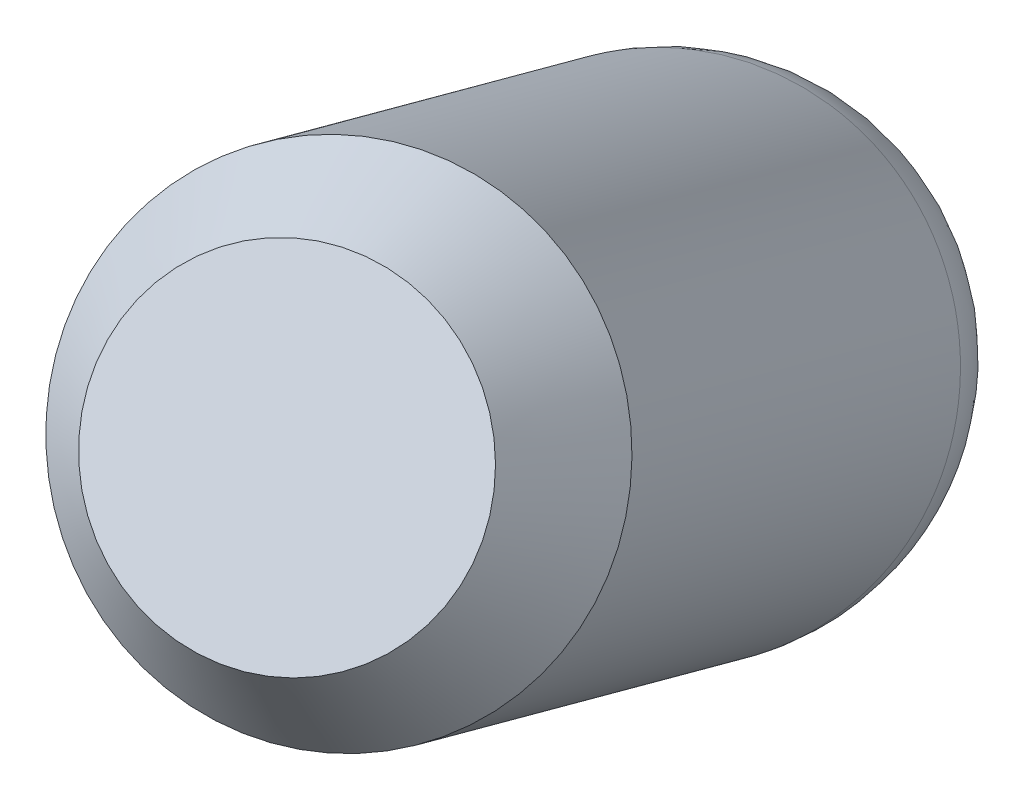
ISO-10303-21;
HEADER;
FILE_DESCRIPTION(('STEP AP214'),'2;1');
FILE_NAME('part.step','',(''),(''),'','','');
FILE_SCHEMA(('AUTOMOTIVE_DESIGN { 1 0 10303 214 1 1 1 1 }'));
ENDSEC;
DATA;
#1=APPLICATION_CONTEXT('core data for automotive mechanical design processes');
#2=APPLICATION_PROTOCOL_DEFINITION('international standard','automotive_design',2000,#1);
#3=PRODUCT_CONTEXT('',#1,'mechanical');
#4=PRODUCT('Part','Part','',(#3));
#5=PRODUCT_RELATED_PRODUCT_CATEGORY('part','',(#4));
#6=PRODUCT_DEFINITION_FORMATION('','',#4);
#7=PRODUCT_DEFINITION_CONTEXT('part definition',#1,'design');
#8=PRODUCT_DEFINITION('design','',#6,#7);
#9=PRODUCT_DEFINITION_SHAPE('','',#8);
#10=(LENGTH_UNIT() NAMED_UNIT(*) SI_UNIT(.MILLI.,.METRE.));
#11=(NAMED_UNIT(*) PLANE_ANGLE_UNIT() SI_UNIT($,.RADIAN.));
#12=(NAMED_UNIT(*) SI_UNIT($,.STERADIAN.) SOLID_ANGLE_UNIT());
#13=UNCERTAINTY_MEASURE_WITH_UNIT(LENGTH_MEASURE(1.E-05),#10,'distance_accuracy_value','');
#14=(GEOMETRIC_REPRESENTATION_CONTEXT(3) GLOBAL_UNCERTAINTY_ASSIGNED_CONTEXT((#13)) GLOBAL_UNIT_ASSIGNED_CONTEXT((#10,
#11,#12)) REPRESENTATION_CONTEXT('',''));
#15=CARTESIAN_POINT('',(0.,0.,0.));
#16=DIRECTION('',(0.,0.,1.));
#17=DIRECTION('',(1.,0.,0.));
#18=AXIS2_PLACEMENT_3D('',#15,#16,#17);
#19=CARTESIAN_POINT('',(-143.954565351431,536.193582255767,-563.997558569731));
#20=DIRECTION('',(0.342020143325556,0.469846310392971,0.813797681349412));
#21=DIRECTION('',(0.,-0.866025403784441,0.499999999999996));
#22=AXIS2_PLACEMENT_3D('',#19,#20,#21);
#23=PLANE('',#22);
#24=CARTESIAN_POINT('',(-139.117363935001,531.413633802481,-563.270816730183));
#25=DIRECTION('',(-0.342020143325572,-0.469846310392955,-0.813797681349414));
#26=DIRECTION('',(0.,0.866025403784449,-0.499999999999982));
#27=AXIS2_PLACEMENT_3D('',#24,#25,#26);
#28=CIRCLE('',#27,4.26794919425475);
#29=CARTESIAN_POINT('',(-139.117363935001,535.109786226767,-565.40479132731));
#30=VERTEX_POINT('',#29);
#31=EDGE_CURVE('E20',#30,#30,#28,.T.);
#32=ORIENTED_EDGE('',*,*,#31,.F.);
#33=EDGE_LOOP('',(#32));
#34=FACE_BOUND('',#33,.T.);
#35=ADVANCED_FACE('F17',(#34),#23,.T.);
#36=CARTESIAN_POINT('',(-140.143424365264,530.004094870909,-565.712209774912));
#37=DIRECTION('',(-0.342020143325572,-0.469846310392955,-0.813797681349414));
#38=DIRECTION('',(0.,0.866025403784449,-0.499999999999982));
#39=AXIS2_PLACEMENT_3D('',#36,#37,#38);
#40=CONICAL_SURFACE('',#39,5.99999999986177,0.523598774986998);
#41=ORIENTED_EDGE('',*,*,#31,.T.);
#42=EDGE_LOOP('',(#41));
#43=FACE_BOUND('',#42,.T.);
#44=CARTESIAN_POINT('',(-140.14342436534,530.004094870805,-565.712209775094));
#45=DIRECTION('',(-0.342020143325557,-0.469846310392979,-0.813797681349406));
#46=DIRECTION('',(0.,0.866025403784436,-0.500000000000005));
#47=AXIS2_PLACEMENT_3D('',#44,#45,#46);
#48=CIRCLE('',#47,6.00000000000005);
#49=CARTESIAN_POINT('',(-140.14342436534,535.200247293511,-568.712209775094));
#50=VERTEX_POINT('',#49);
#51=EDGE_CURVE('E24',#50,#50,#48,.T.);
#52=ORIENTED_EDGE('',*,*,#51,.F.);
#53=EDGE_LOOP('',(#52));
#54=FACE_BOUND('',#53,.T.);
#55=ADVANCED_FACE('F31',(#43,#54),#40,.T.);
#56=CARTESIAN_POINT('',(-146.641807088526,521.077014973337,-581.174365720733));
#57=DIRECTION('',(-1.,0.,0.));
#58=DIRECTION('',(0.,-1.,0.));
#59=AXIS2_PLACEMENT_3D('',#56,#57,#58);
#60=SPHERICAL_SURFACE('',#59,6.);
#61=CARTESIAN_POINT('',(-152.641807088526,521.077014973337,-581.174365720733));
#62=VERTEX_POINT('',#61);
#63=VERTEX_LOOP('',#62);
#64=FACE_BOUND('',#63,.T.);
#65=CARTESIAN_POINT('',(-146.641807088526,521.077014973338,-581.174365720733));
#66=DIRECTION('',(-0.342020143325557,-0.469846310392979,-0.813797681349406));
#67=DIRECTION('',(0.,0.866025403784436,-0.500000000000005));
#68=AXIS2_PLACEMENT_3D('',#65,#66,#67);
#69=CIRCLE('',#68,6.00000000000005);
#70=CARTESIAN_POINT('',(-146.641807088526,526.273167396044,-584.174365720733));
#71=VERTEX_POINT('',#70);
#72=EDGE_CURVE('E11',#71,#71,#69,.F.);
#73=ORIENTED_EDGE('',*,*,#72,.F.);
#74=EDGE_LOOP('',(#73));
#75=FACE_BOUND('',#74,.T.);
#76=ADVANCED_FACE('F27',(#64,#75),#60,.T.);
#77=CARTESIAN_POINT('',(-137.813874236483,533.204288059067,-560.169312578988));
#78=DIRECTION('',(-0.342020143325557,-0.469846310392979,-0.813797681349406));
#79=DIRECTION('',(0.,0.866025403784436,-0.500000000000005));
#80=AXIS2_PLACEMENT_3D('',#77,#78,#79);
#81=CYLINDRICAL_SURFACE('',#80,6.00000000000005);
#82=ORIENTED_EDGE('',*,*,#51,.T.);
#83=EDGE_LOOP('',(#82));
#84=FACE_BOUND('',#83,.T.);
#85=ORIENTED_EDGE('',*,*,#72,.T.);
#86=EDGE_LOOP('',(#85));
#87=FACE_BOUND('',#86,.T.);
#88=ADVANCED_FACE('F30',(#84,#87),#81,.T.);
#89=CLOSED_SHELL('',(#35,#55,#76,#88));
#90=MANIFOLD_SOLID_BREP('B1',#89);
#91=ADVANCED_BREP_SHAPE_REPRESENTATION('',(#18,#90),#14);
#92=SHAPE_DEFINITION_REPRESENTATION(#9,#91);
ENDSEC;
END-ISO-10303-21;
